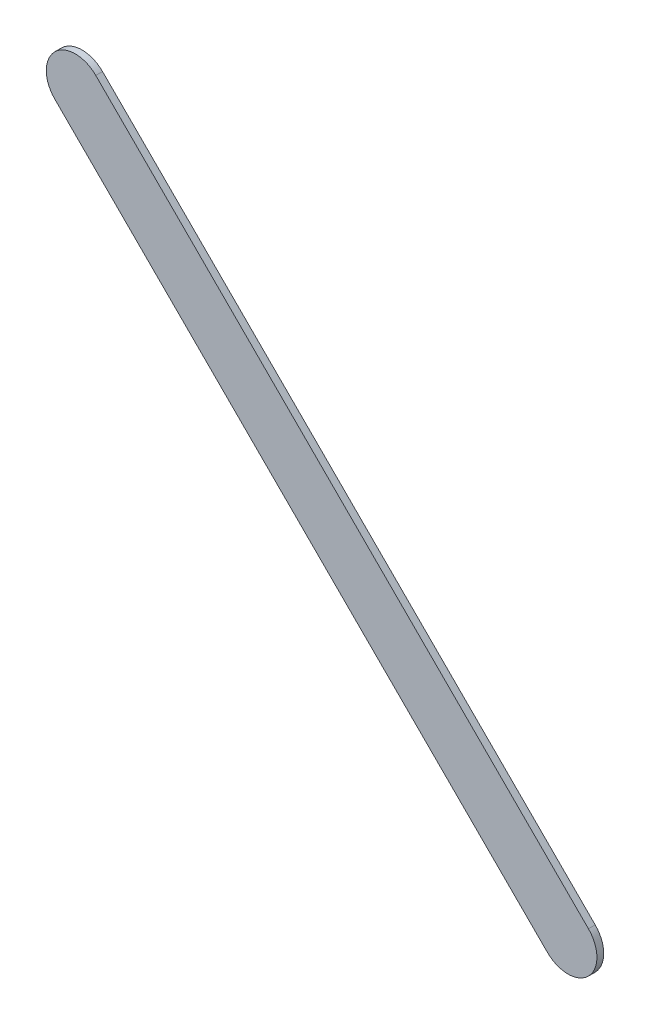
ISO-10303-21;
HEADER;
FILE_DESCRIPTION(('STEP AP214'),'2;1');
FILE_NAME('part.step','',(''),(''),'','','');
FILE_SCHEMA(('AUTOMOTIVE_DESIGN { 1 0 10303 214 1 1 1 1 }'));
ENDSEC;
DATA;
#1=APPLICATION_CONTEXT('core data for automotive mechanical design processes');
#2=APPLICATION_PROTOCOL_DEFINITION('international standard','automotive_design',2000,#1);
#3=PRODUCT_CONTEXT('',#1,'mechanical');
#4=PRODUCT('Part','Part','',(#3));
#5=PRODUCT_RELATED_PRODUCT_CATEGORY('part','',(#4));
#6=PRODUCT_DEFINITION_FORMATION('','',#4);
#7=PRODUCT_DEFINITION_CONTEXT('part definition',#1,'design');
#8=PRODUCT_DEFINITION('design','',#6,#7);
#9=PRODUCT_DEFINITION_SHAPE('','',#8);
#10=(LENGTH_UNIT() NAMED_UNIT(*) SI_UNIT(.MILLI.,.METRE.));
#11=(NAMED_UNIT(*) PLANE_ANGLE_UNIT() SI_UNIT($,.RADIAN.));
#12=(NAMED_UNIT(*) SI_UNIT($,.STERADIAN.) SOLID_ANGLE_UNIT());
#13=UNCERTAINTY_MEASURE_WITH_UNIT(LENGTH_MEASURE(1.E-05),#10,'distance_accuracy_value','');
#14=(GEOMETRIC_REPRESENTATION_CONTEXT(3) GLOBAL_UNCERTAINTY_ASSIGNED_CONTEXT((#13)) GLOBAL_UNIT_ASSIGNED_CONTEXT((#10,
#11,#12)) REPRESENTATION_CONTEXT('',''));
#15=CARTESIAN_POINT('',(0.,0.,0.));
#16=DIRECTION('',(0.,0.,1.));
#17=DIRECTION('',(1.,0.,0.));
#18=AXIS2_PLACEMENT_3D('',#15,#16,#17);
#19=CARTESIAN_POINT('',(126.506066,-52.553933,1.635));
#20=DIRECTION('',(0.,0.,1.));
#21=DIRECTION('',(1.,0.,0.));
#22=AXIS2_PLACEMENT_3D('',#19,#20,#21);
#23=PLANE('',#22);
#24=DIRECTION('',(-0.707106781186548,0.707106781186548,0.));
#25=VECTOR('',#24,1.);
#26=CARTESIAN_POINT('',(126.506066,-52.553933,1.635));
#27=LINE('',#26,#25);
#28=CARTESIAN_POINT('',(126.506066,-52.553933,1.635));
#29=VERTEX_POINT('',#28);
#30=CARTESIAN_POINT('',(123.956066,-50.003933,1.635));
#31=VERTEX_POINT('',#30);
#32=EDGE_CURVE('E68',#29,#31,#27,.T.);
#33=ORIENTED_EDGE('',*,*,#32,.T.);
#34=CARTESIAN_POINT('',(123.8499995,-50.1099995,1.635));
#35=DIRECTION('',(0.,0.,1.));
#36=DIRECTION('',(0.707106781186548,0.707106781186548,0.));
#37=AXIS2_PLACEMENT_3D('',#34,#35,#36);
#38=CIRCLE('',#37,0.150000682813);
#39=CARTESIAN_POINT('',(123.743933,-50.216066,1.635));
#40=VERTEX_POINT('',#39);
#41=EDGE_CURVE('E65',#31,#40,#38,.T.);
#42=ORIENTED_EDGE('',*,*,#41,.T.);
#43=DIRECTION('',(0.707106781186548,-0.707106781186548,0.));
#44=VECTOR('',#43,1.);
#45=CARTESIAN_POINT('',(123.743933,-50.216066,1.635));
#46=LINE('',#45,#44);
#47=CARTESIAN_POINT('',(126.293933,-52.766066,1.635));
#48=VERTEX_POINT('',#47);
#49=EDGE_CURVE('E20',#40,#48,#46,.T.);
#50=ORIENTED_EDGE('',*,*,#49,.T.);
#51=CARTESIAN_POINT('',(126.3999995,-52.6599995,1.635));
#52=DIRECTION('',(0.,0.,1.));
#53=DIRECTION('',(-0.707106781186548,-0.707106781186548,0.));
#54=AXIS2_PLACEMENT_3D('',#51,#52,#53);
#55=CIRCLE('',#54,0.150000682813);
#56=EDGE_CURVE('E11',#48,#29,#55,.T.);
#57=ORIENTED_EDGE('',*,*,#56,.T.);
#58=EDGE_LOOP('',(#33,#42,#50,#57));
#59=FACE_BOUND('',#58,.T.);
#60=ADVANCED_FACE('F17',(#59),#23,.T.);
#61=CARTESIAN_POINT('',(126.506066,-52.553933,1.6));
#62=DIRECTION('',(0.,0.,1.));
#63=DIRECTION('',(1.,0.,0.));
#64=AXIS2_PLACEMENT_3D('',#61,#62,#63);
#65=PLANE('',#64);
#66=CARTESIAN_POINT('',(126.3999995,-52.6599995,1.6));
#67=DIRECTION('',(0.,0.,1.));
#68=DIRECTION('',(-0.707106781186548,-0.707106781186548,0.));
#69=AXIS2_PLACEMENT_3D('',#66,#67,#68);
#70=CIRCLE('',#69,0.150000682813);
#71=CARTESIAN_POINT('',(126.293933,-52.766066,1.6));
#72=VERTEX_POINT('',#71);
#73=CARTESIAN_POINT('',(126.506066,-52.553933,1.6));
#74=VERTEX_POINT('',#73);
#75=EDGE_CURVE('E27',#72,#74,#70,.T.);
#76=ORIENTED_EDGE('',*,*,#75,.F.);
#77=DIRECTION('',(0.707106781186548,-0.707106781186548,0.));
#78=VECTOR('',#77,1.);
#79=CARTESIAN_POINT('',(123.743933,-50.216066,1.6));
#80=LINE('',#79,#78);
#81=CARTESIAN_POINT('',(123.743933,-50.216066,1.6));
#82=VERTEX_POINT('',#81);
#83=EDGE_CURVE('E73',#82,#72,#80,.T.);
#84=ORIENTED_EDGE('',*,*,#83,.F.);
#85=CARTESIAN_POINT('',(123.8499995,-50.1099995,1.6));
#86=DIRECTION('',(0.,0.,1.));
#87=DIRECTION('',(0.707106781186548,0.707106781186548,0.));
#88=AXIS2_PLACEMENT_3D('',#85,#86,#87);
#89=CIRCLE('',#88,0.150000682813);
#90=CARTESIAN_POINT('',(123.956066,-50.003933,1.6));
#91=VERTEX_POINT('',#90);
#92=EDGE_CURVE('E77',#91,#82,#89,.T.);
#93=ORIENTED_EDGE('',*,*,#92,.F.);
#94=DIRECTION('',(-0.707106781186548,0.707106781186548,0.));
#95=VECTOR('',#94,1.);
#96=CARTESIAN_POINT('',(126.506066,-52.553933,1.6));
#97=LINE('',#96,#95);
#98=EDGE_CURVE('E126',#74,#91,#97,.T.);
#99=ORIENTED_EDGE('',*,*,#98,.F.);
#100=EDGE_LOOP('',(#76,#84,#93,#99));
#101=FACE_BOUND('',#100,.T.);
#102=ADVANCED_FACE('F147',(#101),#65,.F.);
#103=CARTESIAN_POINT('',(126.3999995,-52.6599995,1.6));
#104=DIRECTION('',(0.,0.,-1.));
#105=DIRECTION('',(-0.707106781186548,-0.707106781186548,0.));
#106=AXIS2_PLACEMENT_3D('',#103,#104,#105);
#107=CYLINDRICAL_SURFACE('',#106,0.150000682813);
#108=ORIENTED_EDGE('',*,*,#75,.T.);
#109=DIRECTION('',(0.,0.,1.));
#110=VECTOR('',#109,1.);
#111=CARTESIAN_POINT('',(126.506066,-52.553933,1.6));
#112=LINE('',#111,#110);
#113=EDGE_CURVE('E84',#74,#29,#112,.T.);
#114=ORIENTED_EDGE('',*,*,#113,.T.);
#115=ORIENTED_EDGE('',*,*,#56,.F.);
#116=DIRECTION('',(0.,0.,1.));
#117=VECTOR('',#116,1.);
#118=CARTESIAN_POINT('',(126.293933,-52.766066,1.6));
#119=LINE('',#118,#117);
#120=EDGE_CURVE('E60',#72,#48,#119,.T.);
#121=ORIENTED_EDGE('',*,*,#120,.F.);
#122=EDGE_LOOP('',(#108,#114,#115,#121));
#123=FACE_BOUND('',#122,.T.);
#124=ADVANCED_FACE('F155',(#123),#107,.T.);
#125=CARTESIAN_POINT('',(123.743933,-50.216066,1.6));
#126=DIRECTION('',(0.707106781186548,0.707106781186548,0.));
#127=DIRECTION('',(0.,0.,-1.));
#128=AXIS2_PLACEMENT_3D('',#125,#126,#127);
#129=PLANE('',#128);
#130=ORIENTED_EDGE('',*,*,#83,.T.);
#131=ORIENTED_EDGE('',*,*,#120,.T.);
#132=ORIENTED_EDGE('',*,*,#49,.F.);
#133=DIRECTION('',(0.,0.,1.));
#134=VECTOR('',#133,1.);
#135=CARTESIAN_POINT('',(123.743933,-50.216066,1.6));
#136=LINE('',#135,#134);
#137=EDGE_CURVE('E58',#82,#40,#136,.T.);
#138=ORIENTED_EDGE('',*,*,#137,.F.);
#139=EDGE_LOOP('',(#130,#131,#132,#138));
#140=FACE_BOUND('',#139,.T.);
#141=ADVANCED_FACE('F56',(#140),#129,.F.);
#142=CARTESIAN_POINT('',(123.8499995,-50.1099995,1.6));
#143=DIRECTION('',(0.,0.,-1.));
#144=DIRECTION('',(0.707106781186548,0.707106781186548,0.));
#145=AXIS2_PLACEMENT_3D('',#142,#143,#144);
#146=CYLINDRICAL_SURFACE('',#145,0.150000682813);
#147=ORIENTED_EDGE('',*,*,#92,.T.);
#148=ORIENTED_EDGE('',*,*,#137,.T.);
#149=ORIENTED_EDGE('',*,*,#41,.F.);
#150=DIRECTION('',(0.,0.,1.));
#151=VECTOR('',#150,1.);
#152=CARTESIAN_POINT('',(123.956066,-50.003933,1.6));
#153=LINE('',#152,#151);
#154=EDGE_CURVE('E116',#91,#31,#153,.T.);
#155=ORIENTED_EDGE('',*,*,#154,.F.);
#156=EDGE_LOOP('',(#147,#148,#149,#155));
#157=FACE_BOUND('',#156,.T.);
#158=ADVANCED_FACE('F75',(#157),#146,.T.);
#159=CARTESIAN_POINT('',(126.506066,-52.553933,1.6));
#160=DIRECTION('',(-0.707106781186548,-0.707106781186548,0.));
#161=DIRECTION('',(-0.707106781186548,0.707106781186548,0.));
#162=AXIS2_PLACEMENT_3D('',#159,#160,#161);
#163=PLANE('',#162);
#164=ORIENTED_EDGE('',*,*,#98,.T.);
#165=ORIENTED_EDGE('',*,*,#154,.T.);
#166=ORIENTED_EDGE('',*,*,#32,.F.);
#167=ORIENTED_EDGE('',*,*,#113,.F.);
#168=EDGE_LOOP('',(#164,#165,#166,#167));
#169=FACE_BOUND('',#168,.T.);
#170=ADVANCED_FACE('F142',(#169),#163,.F.);
#171=CLOSED_SHELL('',(#60,#102,#124,#141,#158,#170));
#172=MANIFOLD_SOLID_BREP('B1',#171);
#173=ADVANCED_BREP_SHAPE_REPRESENTATION('',(#18,#172),#14);
#174=SHAPE_DEFINITION_REPRESENTATION(#9,#173);
ENDSEC;
END-ISO-10303-21;
